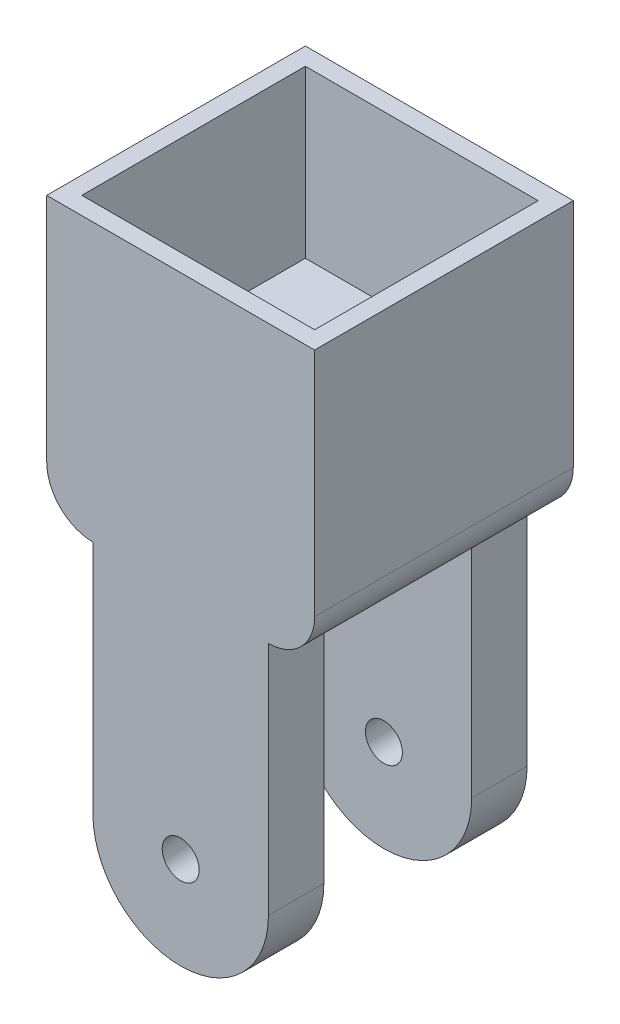
ISO-10303-21;
HEADER;
FILE_DESCRIPTION(('STEP AP214'),'2;1');
FILE_NAME('part.step','',(''),(''),'','','');
FILE_SCHEMA(('AUTOMOTIVE_DESIGN { 1 0 10303 214 1 1 1 1 }'));
ENDSEC;
DATA;
#1=APPLICATION_CONTEXT('core data for automotive mechanical design processes');
#2=APPLICATION_PROTOCOL_DEFINITION('international standard','automotive_design',2000,#1);
#3=PRODUCT_CONTEXT('',#1,'mechanical');
#4=PRODUCT('Part','Part','',(#3));
#5=PRODUCT_RELATED_PRODUCT_CATEGORY('part','',(#4));
#6=PRODUCT_DEFINITION_FORMATION('','',#4);
#7=PRODUCT_DEFINITION_CONTEXT('part definition',#1,'design');
#8=PRODUCT_DEFINITION('design','',#6,#7);
#9=PRODUCT_DEFINITION_SHAPE('','',#8);
#10=(LENGTH_UNIT() NAMED_UNIT(*) SI_UNIT(.MILLI.,.METRE.));
#11=(NAMED_UNIT(*) PLANE_ANGLE_UNIT() SI_UNIT($,.RADIAN.));
#12=(NAMED_UNIT(*) SI_UNIT($,.STERADIAN.) SOLID_ANGLE_UNIT());
#13=UNCERTAINTY_MEASURE_WITH_UNIT(LENGTH_MEASURE(1.E-05),#10,'distance_accuracy_value','');
#14=(GEOMETRIC_REPRESENTATION_CONTEXT(3) GLOBAL_UNCERTAINTY_ASSIGNED_CONTEXT((#13)) GLOBAL_UNIT_ASSIGNED_CONTEXT((#10,
#11,#12)) REPRESENTATION_CONTEXT('',''));
#15=CARTESIAN_POINT('',(0.,0.,0.));
#16=DIRECTION('',(0.,0.,1.));
#17=DIRECTION('',(1.,0.,0.));
#18=AXIS2_PLACEMENT_3D('',#15,#16,#17);
#19=CARTESIAN_POINT('',(0.,30.,0.));
#20=DIRECTION('',(0.,1.,0.));
#21=DIRECTION('',(0.,0.,1.));
#22=AXIS2_PLACEMENT_3D('',#19,#20,#21);
#23=PLANE('',#22);
#24=DIRECTION('',(1.,0.,0.));
#25=VECTOR('',#24,1.);
#26=CARTESIAN_POINT('',(-14.5,30.,-14.));
#27=LINE('',#26,#25);
#28=CARTESIAN_POINT('',(-14.5,30.,-14.));
#29=VERTEX_POINT('',#28);
#30=CARTESIAN_POINT('',(14.5,30.,-14.));
#31=VERTEX_POINT('',#30);
#32=EDGE_CURVE('E250',#29,#31,#27,.T.);
#33=ORIENTED_EDGE('',*,*,#32,.F.);
#34=DIRECTION('',(0.,0.,-1.));
#35=VECTOR('',#34,1.);
#36=CARTESIAN_POINT('',(-14.5,30.,14.));
#37=LINE('',#36,#35);
#38=CARTESIAN_POINT('',(-14.5,30.,14.));
#39=VERTEX_POINT('',#38);
#40=EDGE_CURVE('E257',#39,#29,#37,.T.);
#41=ORIENTED_EDGE('',*,*,#40,.F.);
#42=DIRECTION('',(1.,0.,0.));
#43=VECTOR('',#42,1.);
#44=CARTESIAN_POINT('',(-14.5,30.,14.));
#45=LINE('',#44,#43);
#46=CARTESIAN_POINT('',(14.5,30.,14.));
#47=VERTEX_POINT('',#46);
#48=EDGE_CURVE('E255',#39,#47,#45,.T.);
#49=ORIENTED_EDGE('',*,*,#48,.T.);
#50=DIRECTION('',(0.,0.,-1.));
#51=VECTOR('',#50,1.);
#52=CARTESIAN_POINT('',(14.5,30.,14.));
#53=LINE('',#52,#51);
#54=EDGE_CURVE('E253',#47,#31,#53,.T.);
#55=ORIENTED_EDGE('',*,*,#54,.T.);
#56=EDGE_LOOP('',(#33,#41,#49,#55));
#57=FACE_BOUND('',#56,.T.);
#58=DIRECTION('',(0.,0.,-1.));
#59=VECTOR('',#58,1.);
#60=CARTESIAN_POINT('',(12.6,30.,12.1));
#61=LINE('',#60,#59);
#62=CARTESIAN_POINT('',(12.6,30.,12.1));
#63=VERTEX_POINT('',#62);
#64=CARTESIAN_POINT('',(12.6,30.,-12.1));
#65=VERTEX_POINT('',#64);
#66=EDGE_CURVE('E188',#63,#65,#61,.T.);
#67=ORIENTED_EDGE('',*,*,#66,.F.);
#68=DIRECTION('',(-1.,0.,0.));
#69=VECTOR('',#68,1.);
#70=CARTESIAN_POINT('',(12.6,30.,12.1));
#71=LINE('',#70,#69);
#72=CARTESIAN_POINT('',(-12.6,30.,12.1));
#73=VERTEX_POINT('',#72);
#74=EDGE_CURVE('E168',#63,#73,#71,.T.);
#75=ORIENTED_EDGE('',*,*,#74,.T.);
#76=DIRECTION('',(0.,0.,-1.));
#77=VECTOR('',#76,1.);
#78=CARTESIAN_POINT('',(-12.6,30.,12.1));
#79=LINE('',#78,#77);
#80=CARTESIAN_POINT('',(-12.6,30.,-12.1));
#81=VERTEX_POINT('',#80);
#82=EDGE_CURVE('E178',#73,#81,#79,.T.);
#83=ORIENTED_EDGE('',*,*,#82,.T.);
#84=DIRECTION('',(-1.,0.,0.));
#85=VECTOR('',#84,1.);
#86=CARTESIAN_POINT('',(12.6,30.,-12.1));
#87=LINE('',#86,#85);
#88=EDGE_CURVE('E184',#65,#81,#87,.T.);
#89=ORIENTED_EDGE('',*,*,#88,.F.);
#90=EDGE_LOOP('',(#67,#75,#83,#89));
#91=FACE_BOUND('',#90,.T.);
#92=ADVANCED_FACE('F41',(#57,#91),#23,.T.);
#93=CARTESIAN_POINT('',(0.,0.,0.));
#94=DIRECTION('',(0.,1.,0.));
#95=DIRECTION('',(0.,0.,1.));
#96=AXIS2_PLACEMENT_3D('',#93,#94,#95);
#97=PLANE('',#96);
#98=DIRECTION('',(1.,0.,0.));
#99=VECTOR('',#98,1.);
#100=CARTESIAN_POINT('',(-9.5,0.,8.));
#101=LINE('',#100,#99);
#102=CARTESIAN_POINT('',(-9.5,0.,8.));
#103=VERTEX_POINT('',#102);
#104=CARTESIAN_POINT('',(9.5,0.,8.));
#105=VERTEX_POINT('',#104);
#106=EDGE_CURVE('E219',#103,#105,#101,.T.);
#107=ORIENTED_EDGE('',*,*,#106,.F.);
#108=DIRECTION('',(0.,0.,-1.));
#109=VECTOR('',#108,1.);
#110=CARTESIAN_POINT('',(-9.50000000000001,0.,-14.));
#111=LINE('',#110,#109);
#112=CARTESIAN_POINT('',(-9.5,0.,-8.));
#113=VERTEX_POINT('',#112);
#114=EDGE_CURVE('E277',#103,#113,#111,.T.);
#115=ORIENTED_EDGE('',*,*,#114,.T.);
#116=DIRECTION('',(-1.,0.,0.));
#117=VECTOR('',#116,1.);
#118=CARTESIAN_POINT('',(-9.5,0.,-8.));
#119=LINE('',#118,#117);
#120=CARTESIAN_POINT('',(9.5,0.,-8.));
#121=VERTEX_POINT('',#120);
#122=EDGE_CURVE('E239',#121,#113,#119,.T.);
#123=ORIENTED_EDGE('',*,*,#122,.F.);
#124=DIRECTION('',(0.,0.,-1.));
#125=VECTOR('',#124,1.);
#126=CARTESIAN_POINT('',(9.5,0.,0.));
#127=LINE('',#126,#125);
#128=EDGE_CURVE('E264',#121,#105,#127,.F.);
#129=ORIENTED_EDGE('',*,*,#128,.T.);
#130=EDGE_LOOP('',(#107,#115,#123,#129));
#131=FACE_BOUND('',#130,.T.);
#132=ADVANCED_FACE('F347',(#131),#97,.F.);
#133=CARTESIAN_POINT('',(-14.5,30.,-14.));
#134=DIRECTION('',(0.,0.,-1.));
#135=DIRECTION('',(-1.,0.,0.));
#136=AXIS2_PLACEMENT_3D('',#133,#134,#135);
#137=PLANE('',#136);
#138=CARTESIAN_POINT('',(0.,-25.,-14.));
#139=DIRECTION('',(0.,0.,-1.));
#140=DIRECTION('',(-1.,0.,0.));
#141=AXIS2_PLACEMENT_3D('',#138,#139,#140);
#142=CIRCLE('',#141,2.);
#143=CARTESIAN_POINT('',(-2.,-25.,-14.));
#144=VERTEX_POINT('',#143);
#145=EDGE_CURVE('E206',#144,#144,#142,.T.);
#146=ORIENTED_EDGE('',*,*,#145,.F.);
#147=EDGE_LOOP('',(#146));
#148=FACE_BOUND('',#147,.T.);
#149=DIRECTION('',(0.,1.,0.));
#150=VECTOR('',#149,1.);
#151=CARTESIAN_POINT('',(9.5,-35.,-14.));
#152=LINE('',#151,#150);
#153=CARTESIAN_POINT('',(9.5,-25.5,-14.));
#154=VERTEX_POINT('',#153);
#155=CARTESIAN_POINT('',(9.49999999999999,0.,-14.));
#156=VERTEX_POINT('',#155);
#157=EDGE_CURVE('E246',#154,#156,#152,.T.);
#158=ORIENTED_EDGE('',*,*,#157,.F.);
#159=CARTESIAN_POINT('',(0.,-25.5,-14.));
#160=DIRECTION('',(0.,0.,-1.));
#161=DIRECTION('',(-1.,0.,0.));
#162=AXIS2_PLACEMENT_3D('',#159,#160,#161);
#163=CIRCLE('',#162,9.5);
#164=CARTESIAN_POINT('',(0.,-35.,-14.));
#165=VERTEX_POINT('',#164);
#166=EDGE_CURVE('E304',#154,#165,#163,.T.);
#167=ORIENTED_EDGE('',*,*,#166,.T.);
#168=CARTESIAN_POINT('',(0.,-25.5,-14.));
#169=DIRECTION('',(0.,0.,-1.));
#170=DIRECTION('',(-1.,0.,0.));
#171=AXIS2_PLACEMENT_3D('',#168,#169,#170);
#172=CIRCLE('',#171,9.5);
#173=CARTESIAN_POINT('',(-9.50000000000001,-25.5,-14.));
#174=VERTEX_POINT('',#173);
#175=EDGE_CURVE('E302',#165,#174,#172,.T.);
#176=ORIENTED_EDGE('',*,*,#175,.T.);
#177=DIRECTION('',(0.,1.,0.));
#178=VECTOR('',#177,1.);
#179=CARTESIAN_POINT('',(-9.50000000000001,-35.,-14.));
#180=LINE('',#179,#178);
#181=CARTESIAN_POINT('',(-9.50000000000001,0.,-14.));
#182=VERTEX_POINT('',#181);
#183=EDGE_CURVE('E248',#174,#182,#180,.T.);
#184=ORIENTED_EDGE('',*,*,#183,.T.);
#185=CARTESIAN_POINT('',(-9.50000000000001,5.,-14.));
#186=DIRECTION('',(0.,0.,-1.));
#187=DIRECTION('',(-1.,0.,0.));
#188=AXIS2_PLACEMENT_3D('',#185,#186,#187);
#189=CIRCLE('',#188,5.);
#190=CARTESIAN_POINT('',(-14.5,5.,-14.));
#191=VERTEX_POINT('',#190);
#192=EDGE_CURVE('E283',#182,#191,#189,.T.);
#193=ORIENTED_EDGE('',*,*,#192,.T.);
#194=DIRECTION('',(0.,-1.,0.));
#195=VECTOR('',#194,1.);
#196=CARTESIAN_POINT('',(-14.5,30.,-14.));
#197=LINE('',#196,#195);
#198=EDGE_CURVE('E261',#29,#191,#197,.T.);
#199=ORIENTED_EDGE('',*,*,#198,.F.);
#200=ORIENTED_EDGE('',*,*,#32,.T.);
#201=DIRECTION('',(0.,-1.,0.));
#202=VECTOR('',#201,1.);
#203=CARTESIAN_POINT('',(14.5,30.,-14.));
#204=LINE('',#203,#202);
#205=CARTESIAN_POINT('',(14.5,5.,-14.));
#206=VERTEX_POINT('',#205);
#207=EDGE_CURVE('E260',#31,#206,#204,.T.);
#208=ORIENTED_EDGE('',*,*,#207,.T.);
#209=CARTESIAN_POINT('',(9.5,5.,-14.));
#210=DIRECTION('',(0.,0.,-1.));
#211=DIRECTION('',(-1.,0.,0.));
#212=AXIS2_PLACEMENT_3D('',#209,#210,#211);
#213=CIRCLE('',#212,5.);
#214=EDGE_CURVE('E280',#206,#156,#213,.T.);
#215=ORIENTED_EDGE('',*,*,#214,.T.);
#216=EDGE_LOOP('',(#158,#167,#176,#184,#193,#199,#200,#208,#215));
#217=FACE_BOUND('',#216,.T.);
#218=ADVANCED_FACE('F367',(#148,#217),#137,.T.);
#219=CARTESIAN_POINT('',(-14.5,30.,14.));
#220=DIRECTION('',(-1.,0.,0.));
#221=DIRECTION('',(0.,0.,1.));
#222=AXIS2_PLACEMENT_3D('',#219,#220,#221);
#223=PLANE('',#222);
#224=ORIENTED_EDGE('',*,*,#198,.T.);
#225=DIRECTION('',(0.,0.,-1.));
#226=VECTOR('',#225,1.);
#227=CARTESIAN_POINT('',(-14.5,5.,14.));
#228=LINE('',#227,#226);
#229=CARTESIAN_POINT('',(-14.5,5.,14.));
#230=VERTEX_POINT('',#229);
#231=EDGE_CURVE('E285',#191,#230,#228,.F.);
#232=ORIENTED_EDGE('',*,*,#231,.T.);
#233=DIRECTION('',(0.,-1.,0.));
#234=VECTOR('',#233,1.);
#235=CARTESIAN_POINT('',(-14.5,30.,14.));
#236=LINE('',#235,#234);
#237=EDGE_CURVE('E265',#39,#230,#236,.T.);
#238=ORIENTED_EDGE('',*,*,#237,.F.);
#239=ORIENTED_EDGE('',*,*,#40,.T.);
#240=EDGE_LOOP('',(#224,#232,#238,#239));
#241=FACE_BOUND('',#240,.T.);
#242=ADVANCED_FACE('F372',(#241),#223,.T.);
#243=CARTESIAN_POINT('',(-14.5,30.,14.));
#244=DIRECTION('',(0.,0.,-1.));
#245=DIRECTION('',(-1.,0.,0.));
#246=AXIS2_PLACEMENT_3D('',#243,#244,#245);
#247=PLANE('',#246);
#248=CARTESIAN_POINT('',(0.,-25.,14.));
#249=DIRECTION('',(0.,0.,-1.));
#250=DIRECTION('',(-1.,0.,0.));
#251=AXIS2_PLACEMENT_3D('',#248,#249,#250);
#252=CIRCLE('',#251,2.);
#253=CARTESIAN_POINT('',(-2.,-25.,14.));
#254=VERTEX_POINT('',#253);
#255=EDGE_CURVE('E207',#254,#254,#252,.T.);
#256=ORIENTED_EDGE('',*,*,#255,.T.);
#257=EDGE_LOOP('',(#256));
#258=FACE_BOUND('',#257,.T.);
#259=CARTESIAN_POINT('',(0.,-25.5,14.));
#260=DIRECTION('',(0.,0.,-1.));
#261=DIRECTION('',(-1.,0.,0.));
#262=AXIS2_PLACEMENT_3D('',#259,#260,#261);
#263=CIRCLE('',#262,9.5);
#264=CARTESIAN_POINT('',(-9.50000000000001,-25.5,14.));
#265=VERTEX_POINT('',#264);
#266=CARTESIAN_POINT('',(0.,-35.,14.));
#267=VERTEX_POINT('',#266);
#268=EDGE_CURVE('E308',#265,#267,#263,.F.);
#269=ORIENTED_EDGE('',*,*,#268,.T.);
#270=CARTESIAN_POINT('',(0.,-25.5,14.));
#271=DIRECTION('',(0.,0.,-1.));
#272=DIRECTION('',(-1.,0.,0.));
#273=AXIS2_PLACEMENT_3D('',#270,#271,#272);
#274=CIRCLE('',#273,9.5);
#275=CARTESIAN_POINT('',(9.5,-25.5,14.));
#276=VERTEX_POINT('',#275);
#277=EDGE_CURVE('E310',#267,#276,#274,.F.);
#278=ORIENTED_EDGE('',*,*,#277,.T.);
#279=DIRECTION('',(0.,1.,0.));
#280=VECTOR('',#279,1.);
#281=CARTESIAN_POINT('',(9.5,-35.,14.));
#282=LINE('',#281,#280);
#283=CARTESIAN_POINT('',(9.49999999999999,0.,14.));
#284=VERTEX_POINT('',#283);
#285=EDGE_CURVE('E227',#276,#284,#282,.T.);
#286=ORIENTED_EDGE('',*,*,#285,.T.);
#287=CARTESIAN_POINT('',(9.5,5.,14.));
#288=DIRECTION('',(0.,0.,-1.));
#289=DIRECTION('',(-1.,0.,0.));
#290=AXIS2_PLACEMENT_3D('',#287,#288,#289);
#291=CIRCLE('',#290,5.);
#292=CARTESIAN_POINT('',(14.5,5.,14.));
#293=VERTEX_POINT('',#292);
#294=EDGE_CURVE('E287',#284,#293,#291,.F.);
#295=ORIENTED_EDGE('',*,*,#294,.T.);
#296=DIRECTION('',(0.,-1.,0.));
#297=VECTOR('',#296,1.);
#298=CARTESIAN_POINT('',(14.5,30.,14.));
#299=LINE('',#298,#297);
#300=EDGE_CURVE('E268',#47,#293,#299,.T.);
#301=ORIENTED_EDGE('',*,*,#300,.F.);
#302=ORIENTED_EDGE('',*,*,#48,.F.);
#303=ORIENTED_EDGE('',*,*,#237,.T.);
#304=CARTESIAN_POINT('',(-9.50000000000001,5.,14.));
#305=DIRECTION('',(0.,0.,-1.));
#306=DIRECTION('',(-1.,0.,0.));
#307=AXIS2_PLACEMENT_3D('',#304,#305,#306);
#308=CIRCLE('',#307,5.);
#309=CARTESIAN_POINT('',(-9.50000000000001,0.,14.));
#310=VERTEX_POINT('',#309);
#311=EDGE_CURVE('E289',#230,#310,#308,.F.);
#312=ORIENTED_EDGE('',*,*,#311,.T.);
#313=DIRECTION('',(0.,1.,0.));
#314=VECTOR('',#313,1.);
#315=CARTESIAN_POINT('',(-9.50000000000001,-35.,14.));
#316=LINE('',#315,#314);
#317=EDGE_CURVE('E225',#265,#310,#316,.T.);
#318=ORIENTED_EDGE('',*,*,#317,.F.);
#319=EDGE_LOOP('',(#269,#278,#286,#295,#301,#302,#303,#312,#318));
#320=FACE_BOUND('',#319,.T.);
#321=ADVANCED_FACE('F336',(#258,#320),#247,.F.);
#322=CARTESIAN_POINT('',(14.5,30.,14.));
#323=DIRECTION('',(-1.,0.,0.));
#324=DIRECTION('',(0.,0.,1.));
#325=AXIS2_PLACEMENT_3D('',#322,#323,#324);
#326=PLANE('',#325);
#327=ORIENTED_EDGE('',*,*,#300,.T.);
#328=DIRECTION('',(0.,0.,-1.));
#329=VECTOR('',#328,1.);
#330=CARTESIAN_POINT('',(14.5,5.,14.));
#331=LINE('',#330,#329);
#332=EDGE_CURVE('E292',#293,#206,#331,.T.);
#333=ORIENTED_EDGE('',*,*,#332,.T.);
#334=ORIENTED_EDGE('',*,*,#207,.F.);
#335=ORIENTED_EDGE('',*,*,#54,.F.);
#336=EDGE_LOOP('',(#327,#333,#334,#335));
#337=FACE_BOUND('',#336,.T.);
#338=ADVANCED_FACE('F363',(#337),#326,.F.);
#339=CARTESIAN_POINT('',(-9.50000000000001,-35.,-14.));
#340=DIRECTION('',(1.,0.,0.));
#341=DIRECTION('',(0.,0.,-1.));
#342=AXIS2_PLACEMENT_3D('',#339,#340,#341);
#343=PLANE('',#342);
#344=ORIENTED_EDGE('',*,*,#183,.F.);
#345=DIRECTION('',(0.,0.,-1.));
#346=VECTOR('',#345,1.);
#347=CARTESIAN_POINT('',(-9.50000000000001,-25.5,-14.));
#348=LINE('',#347,#346);
#349=CARTESIAN_POINT('',(-9.5,-25.5,-8.));
#350=VERTEX_POINT('',#349);
#351=EDGE_CURVE('E306',#174,#350,#348,.F.);
#352=ORIENTED_EDGE('',*,*,#351,.T.);
#353=DIRECTION('',(0.,1.,0.));
#354=VECTOR('',#353,1.);
#355=CARTESIAN_POINT('',(-9.5,-35.,-8.));
#356=LINE('',#355,#354);
#357=EDGE_CURVE('E242',#350,#113,#356,.T.);
#358=ORIENTED_EDGE('',*,*,#357,.T.);
#359=DIRECTION('',(0.,0.,-1.));
#360=VECTOR('',#359,1.);
#361=CARTESIAN_POINT('',(-9.50000000000001,0.,-14.));
#362=LINE('',#361,#360);
#363=EDGE_CURVE('E233',#113,#182,#362,.T.);
#364=ORIENTED_EDGE('',*,*,#363,.T.);
#365=EDGE_LOOP('',(#344,#352,#358,#364));
#366=FACE_BOUND('',#365,.T.);
#367=ADVANCED_FACE('F378',(#366),#343,.F.);
#368=CARTESIAN_POINT('',(9.5,-35.,-14.));
#369=DIRECTION('',(-1.,0.,0.));
#370=DIRECTION('',(0.,0.,1.));
#371=AXIS2_PLACEMENT_3D('',#368,#369,#370);
#372=PLANE('',#371);
#373=DIRECTION('',(0.,1.,0.));
#374=VECTOR('',#373,1.);
#375=CARTESIAN_POINT('',(9.5,-35.,-8.));
#376=LINE('',#375,#374);
#377=CARTESIAN_POINT('',(9.5,-25.5,-8.));
#378=VERTEX_POINT('',#377);
#379=EDGE_CURVE('E244',#378,#121,#376,.T.);
#380=ORIENTED_EDGE('',*,*,#379,.F.);
#381=DIRECTION('',(0.,0.,1.));
#382=VECTOR('',#381,1.);
#383=CARTESIAN_POINT('',(9.5,-25.5,-14.));
#384=LINE('',#383,#382);
#385=EDGE_CURVE('E299',#378,#154,#384,.F.);
#386=ORIENTED_EDGE('',*,*,#385,.T.);
#387=ORIENTED_EDGE('',*,*,#157,.T.);
#388=DIRECTION('',(0.,0.,1.));
#389=VECTOR('',#388,1.);
#390=CARTESIAN_POINT('',(9.5,0.,-14.));
#391=LINE('',#390,#389);
#392=EDGE_CURVE('E236',#156,#121,#391,.T.);
#393=ORIENTED_EDGE('',*,*,#392,.T.);
#394=EDGE_LOOP('',(#380,#386,#387,#393));
#395=FACE_BOUND('',#394,.T.);
#396=ADVANCED_FACE('F389',(#395),#372,.F.);
#397=CARTESIAN_POINT('',(-9.5,-35.,-8.));
#398=DIRECTION('',(0.,0.,-1.));
#399=DIRECTION('',(-1.,0.,0.));
#400=AXIS2_PLACEMENT_3D('',#397,#398,#399);
#401=PLANE('',#400);
#402=CARTESIAN_POINT('',(0.,-25.,-8.00000000000001));
#403=DIRECTION('',(0.,0.,-1.));
#404=DIRECTION('',(-1.,0.,0.));
#405=AXIS2_PLACEMENT_3D('',#402,#403,#404);
#406=CIRCLE('',#405,2.);
#407=CARTESIAN_POINT('',(-2.,-25.,-8.00000000000001));
#408=VERTEX_POINT('',#407);
#409=EDGE_CURVE('E213',#408,#408,#406,.T.);
#410=ORIENTED_EDGE('',*,*,#409,.T.);
#411=EDGE_LOOP('',(#410));
#412=FACE_BOUND('',#411,.T.);
#413=CARTESIAN_POINT('',(0.,-25.5,-8.));
#414=DIRECTION('',(0.,0.,-1.));
#415=DIRECTION('',(-1.,0.,0.));
#416=AXIS2_PLACEMENT_3D('',#413,#414,#415);
#417=CIRCLE('',#416,9.5);
#418=CARTESIAN_POINT('',(0.,-35.,-8.));
#419=VERTEX_POINT('',#418);
#420=EDGE_CURVE('E295',#350,#419,#417,.F.);
#421=ORIENTED_EDGE('',*,*,#420,.T.);
#422=CARTESIAN_POINT('',(0.,-25.5,-8.));
#423=DIRECTION('',(0.,0.,-1.));
#424=DIRECTION('',(-1.,0.,0.));
#425=AXIS2_PLACEMENT_3D('',#422,#423,#424);
#426=CIRCLE('',#425,9.5);
#427=EDGE_CURVE('E297',#419,#378,#426,.F.);
#428=ORIENTED_EDGE('',*,*,#427,.T.);
#429=ORIENTED_EDGE('',*,*,#379,.T.);
#430=ORIENTED_EDGE('',*,*,#122,.T.);
#431=ORIENTED_EDGE('',*,*,#357,.F.);
#432=EDGE_LOOP('',(#421,#428,#429,#430,#431));
#433=FACE_BOUND('',#432,.T.);
#434=ADVANCED_FACE('F382',(#412,#433),#401,.F.);
#435=CARTESIAN_POINT('',(-9.50000000000001,-35.,14.));
#436=DIRECTION('',(1.,0.,0.));
#437=DIRECTION('',(0.,0.,-1.));
#438=AXIS2_PLACEMENT_3D('',#435,#436,#437);
#439=PLANE('',#438);
#440=DIRECTION('',(0.,1.,0.));
#441=VECTOR('',#440,1.);
#442=CARTESIAN_POINT('',(-9.5,-35.,8.));
#443=LINE('',#442,#441);
#444=CARTESIAN_POINT('',(-9.5,-25.5,8.));
#445=VERTEX_POINT('',#444);
#446=EDGE_CURVE('E231',#445,#103,#443,.T.);
#447=ORIENTED_EDGE('',*,*,#446,.F.);
#448=DIRECTION('',(0.,0.,-1.));
#449=VECTOR('',#448,1.);
#450=CARTESIAN_POINT('',(-9.50000000000001,-25.5,14.));
#451=LINE('',#450,#449);
#452=EDGE_CURVE('E12',#445,#265,#451,.F.);
#453=ORIENTED_EDGE('',*,*,#452,.T.);
#454=ORIENTED_EDGE('',*,*,#317,.T.);
#455=DIRECTION('',(0.,0.,-1.));
#456=VECTOR('',#455,1.);
#457=CARTESIAN_POINT('',(-9.50000000000001,0.,14.));
#458=LINE('',#457,#456);
#459=EDGE_CURVE('E216',#310,#103,#458,.T.);
#460=ORIENTED_EDGE('',*,*,#459,.T.);
#461=EDGE_LOOP('',(#447,#453,#454,#460));
#462=FACE_BOUND('',#461,.T.);
#463=ADVANCED_FACE('F334',(#462),#439,.F.);
#464=CARTESIAN_POINT('',(-9.5,-35.,8.));
#465=DIRECTION('',(0.,0.,1.));
#466=DIRECTION('',(1.,0.,0.));
#467=AXIS2_PLACEMENT_3D('',#464,#465,#466);
#468=PLANE('',#467);
#469=CARTESIAN_POINT('',(0.,-25.,8.));
#470=DIRECTION('',(0.,0.,1.));
#471=DIRECTION('',(1.,0.,0.));
#472=AXIS2_PLACEMENT_3D('',#469,#470,#471);
#473=CIRCLE('',#472,2.);
#474=CARTESIAN_POINT('',(2.,-25.,8.));
#475=VERTEX_POINT('',#474);
#476=EDGE_CURVE('E210',#475,#475,#473,.T.);
#477=ORIENTED_EDGE('',*,*,#476,.T.);
#478=EDGE_LOOP('',(#477));
#479=FACE_BOUND('',#478,.T.);
#480=DIRECTION('',(0.,1.,0.));
#481=VECTOR('',#480,1.);
#482=CARTESIAN_POINT('',(9.5,-35.,8.));
#483=LINE('',#482,#481);
#484=CARTESIAN_POINT('',(9.5,-25.5,8.));
#485=VERTEX_POINT('',#484);
#486=EDGE_CURVE('E229',#485,#105,#483,.T.);
#487=ORIENTED_EDGE('',*,*,#486,.F.);
#488=CARTESIAN_POINT('',(0.,-25.5,8.));
#489=DIRECTION('',(0.,0.,1.));
#490=DIRECTION('',(1.,0.,0.));
#491=AXIS2_PLACEMENT_3D('',#488,#489,#490);
#492=CIRCLE('',#491,9.5);
#493=CARTESIAN_POINT('',(0.,-35.,8.));
#494=VERTEX_POINT('',#493);
#495=EDGE_CURVE('E50',#485,#494,#492,.F.);
#496=ORIENTED_EDGE('',*,*,#495,.T.);
#497=CARTESIAN_POINT('',(0.,-25.5,8.));
#498=DIRECTION('',(0.,0.,1.));
#499=DIRECTION('',(1.,0.,0.));
#500=AXIS2_PLACEMENT_3D('',#497,#498,#499);
#501=CIRCLE('',#500,9.5);
#502=EDGE_CURVE('E58',#494,#445,#501,.F.);
#503=ORIENTED_EDGE('',*,*,#502,.T.);
#504=ORIENTED_EDGE('',*,*,#446,.T.);
#505=ORIENTED_EDGE('',*,*,#106,.T.);
#506=EDGE_LOOP('',(#487,#496,#503,#504,#505));
#507=FACE_BOUND('',#506,.T.);
#508=ADVANCED_FACE('F351',(#479,#507),#468,.F.);
#509=CARTESIAN_POINT('',(9.5,-35.,14.));
#510=DIRECTION('',(-1.,0.,0.));
#511=DIRECTION('',(0.,0.,1.));
#512=AXIS2_PLACEMENT_3D('',#509,#510,#511);
#513=PLANE('',#512);
#514=ORIENTED_EDGE('',*,*,#285,.F.);
#515=DIRECTION('',(0.,0.,1.));
#516=VECTOR('',#515,1.);
#517=CARTESIAN_POINT('',(9.5,-25.5,8.));
#518=LINE('',#517,#516);
#519=EDGE_CURVE('E312',#276,#485,#518,.F.);
#520=ORIENTED_EDGE('',*,*,#519,.T.);
#521=ORIENTED_EDGE('',*,*,#486,.T.);
#522=DIRECTION('',(0.,0.,1.));
#523=VECTOR('',#522,1.);
#524=CARTESIAN_POINT('',(9.5,0.,14.));
#525=LINE('',#524,#523);
#526=EDGE_CURVE('E222',#105,#284,#525,.T.);
#527=ORIENTED_EDGE('',*,*,#526,.T.);
#528=EDGE_LOOP('',(#514,#520,#521,#527));
#529=FACE_BOUND('',#528,.T.);
#530=ADVANCED_FACE('F359',(#529),#513,.F.);
#531=CARTESIAN_POINT('',(0.,-25.,14.));
#532=DIRECTION('',(0.,0.,-1.));
#533=DIRECTION('',(-1.,0.,0.));
#534=AXIS2_PLACEMENT_3D('',#531,#532,#533);
#535=CYLINDRICAL_SURFACE('',#534,2.);
#536=ORIENTED_EDGE('',*,*,#255,.F.);
#537=EDGE_LOOP('',(#536));
#538=FACE_BOUND('',#537,.T.);
#539=ORIENTED_EDGE('',*,*,#476,.F.);
#540=EDGE_LOOP('',(#539));
#541=FACE_BOUND('',#540,.T.);
#542=ADVANCED_FACE('F506',(#538,#541),#535,.F.);
#543=ORIENTED_EDGE('',*,*,#145,.T.);
#544=EDGE_LOOP('',(#543));
#545=FACE_BOUND('',#544,.T.);
#546=ORIENTED_EDGE('',*,*,#409,.F.);
#547=EDGE_LOOP('',(#546));
#548=FACE_BOUND('',#547,.T.);
#549=ADVANCED_FACE('F499',(#545,#548),#535,.F.);
#550=CARTESIAN_POINT('',(12.6,-34.9382312088062,12.1));
#551=DIRECTION('',(0.,0.,-1.));
#552=DIRECTION('',(-1.,0.,0.));
#553=AXIS2_PLACEMENT_3D('',#550,#551,#552);
#554=PLANE('',#553);
#555=DIRECTION('',(0.,1.,0.));
#556=VECTOR('',#555,1.);
#557=CARTESIAN_POINT('',(-12.6,-34.9382312088062,12.1));
#558=LINE('',#557,#556);
#559=CARTESIAN_POINT('',(-12.6,12.,12.1));
#560=VERTEX_POINT('',#559);
#561=EDGE_CURVE('E163',#560,#73,#558,.T.);
#562=ORIENTED_EDGE('',*,*,#561,.T.);
#563=ORIENTED_EDGE('',*,*,#74,.F.);
#564=DIRECTION('',(0.,1.,0.));
#565=VECTOR('',#564,1.);
#566=CARTESIAN_POINT('',(12.6,-34.9382312088062,12.1));
#567=LINE('',#566,#565);
#568=CARTESIAN_POINT('',(12.6,12.,12.1));
#569=VERTEX_POINT('',#568);
#570=EDGE_CURVE('E199',#569,#63,#567,.T.);
#571=ORIENTED_EDGE('',*,*,#570,.F.);
#572=DIRECTION('',(1.,0.,0.));
#573=VECTOR('',#572,1.);
#574=CARTESIAN_POINT('',(12.6,12.,12.1));
#575=LINE('',#574,#573);
#576=EDGE_CURVE('E171',#560,#569,#575,.T.);
#577=ORIENTED_EDGE('',*,*,#576,.F.);
#578=EDGE_LOOP('',(#562,#563,#571,#577));
#579=FACE_BOUND('',#578,.T.);
#580=ADVANCED_FACE('F165',(#579),#554,.T.);
#581=CARTESIAN_POINT('',(-12.6,-34.9382312088062,12.1));
#582=DIRECTION('',(1.,0.,0.));
#583=DIRECTION('',(0.,0.,-1.));
#584=AXIS2_PLACEMENT_3D('',#581,#582,#583);
#585=PLANE('',#584);
#586=DIRECTION('',(0.,1.,0.));
#587=VECTOR('',#586,1.);
#588=CARTESIAN_POINT('',(-12.6,-34.9382312088062,-12.1));
#589=LINE('',#588,#587);
#590=CARTESIAN_POINT('',(-12.6,12.,-12.1));
#591=VERTEX_POINT('',#590);
#592=EDGE_CURVE('E175',#591,#81,#589,.T.);
#593=ORIENTED_EDGE('',*,*,#592,.T.);
#594=ORIENTED_EDGE('',*,*,#82,.F.);
#595=ORIENTED_EDGE('',*,*,#561,.F.);
#596=DIRECTION('',(0.,0.,1.));
#597=VECTOR('',#596,1.);
#598=CARTESIAN_POINT('',(-12.6,12.,12.1));
#599=LINE('',#598,#597);
#600=EDGE_CURVE('E637',#591,#560,#599,.T.);
#601=ORIENTED_EDGE('',*,*,#600,.F.);
#602=EDGE_LOOP('',(#593,#594,#595,#601));
#603=FACE_BOUND('',#602,.T.);
#604=ADVANCED_FACE('F179',(#603),#585,.T.);
#605=CARTESIAN_POINT('',(12.6,-34.9382312088062,-12.1));
#606=DIRECTION('',(0.,0.,-1.));
#607=DIRECTION('',(-1.,0.,0.));
#608=AXIS2_PLACEMENT_3D('',#605,#606,#607);
#609=PLANE('',#608);
#610=DIRECTION('',(1.,0.,0.));
#611=VECTOR('',#610,1.);
#612=CARTESIAN_POINT('',(12.6,12.,-12.1));
#613=LINE('',#612,#611);
#614=CARTESIAN_POINT('',(12.6,12.,-12.1));
#615=VERTEX_POINT('',#614);
#616=EDGE_CURVE('E174',#591,#615,#613,.T.);
#617=ORIENTED_EDGE('',*,*,#616,.T.);
#618=DIRECTION('',(0.,1.,0.));
#619=VECTOR('',#618,1.);
#620=CARTESIAN_POINT('',(12.6,-34.9382312088062,-12.1));
#621=LINE('',#620,#619);
#622=EDGE_CURVE('E201',#615,#65,#621,.T.);
#623=ORIENTED_EDGE('',*,*,#622,.T.);
#624=ORIENTED_EDGE('',*,*,#88,.T.);
#625=ORIENTED_EDGE('',*,*,#592,.F.);
#626=EDGE_LOOP('',(#617,#623,#624,#625));
#627=FACE_BOUND('',#626,.T.);
#628=ADVANCED_FACE('F478',(#627),#609,.F.);
#629=CARTESIAN_POINT('',(12.6,-34.9382312088062,12.1));
#630=DIRECTION('',(1.,0.,0.));
#631=DIRECTION('',(0.,0.,-1.));
#632=AXIS2_PLACEMENT_3D('',#629,#630,#631);
#633=PLANE('',#632);
#634=DIRECTION('',(0.,0.,1.));
#635=VECTOR('',#634,1.);
#636=CARTESIAN_POINT('',(12.6,12.,12.1));
#637=LINE('',#636,#635);
#638=EDGE_CURVE('E204',#615,#569,#637,.T.);
#639=ORIENTED_EDGE('',*,*,#638,.T.);
#640=ORIENTED_EDGE('',*,*,#570,.T.);
#641=ORIENTED_EDGE('',*,*,#66,.T.);
#642=ORIENTED_EDGE('',*,*,#622,.F.);
#643=EDGE_LOOP('',(#639,#640,#641,#642));
#644=FACE_BOUND('',#643,.T.);
#645=ADVANCED_FACE('F470',(#644),#633,.F.);
#646=CARTESIAN_POINT('',(0.,12.,0.));
#647=DIRECTION('',(0.,1.,0.));
#648=DIRECTION('',(0.,0.,1.));
#649=AXIS2_PLACEMENT_3D('',#646,#647,#648);
#650=PLANE('',#649);
#651=CARTESIAN_POINT('',(0.,12.,0.));
#652=DIRECTION('',(0.,1.,0.));
#653=DIRECTION('',(0.,0.,1.));
#654=AXIS2_PLACEMENT_3D('',#651,#652,#653);
#655=CIRCLE('',#654,5.1);
#656=CARTESIAN_POINT('',(0.,12.,5.1));
#657=VERTEX_POINT('',#656);
#658=EDGE_CURVE('E192',#657,#657,#655,.T.);
#659=ORIENTED_EDGE('',*,*,#658,.F.);
#660=EDGE_LOOP('',(#659));
#661=FACE_BOUND('',#660,.T.);
#662=ORIENTED_EDGE('',*,*,#600,.T.);
#663=ORIENTED_EDGE('',*,*,#576,.T.);
#664=ORIENTED_EDGE('',*,*,#638,.F.);
#665=ORIENTED_EDGE('',*,*,#616,.F.);
#666=EDGE_LOOP('',(#662,#663,#664,#665));
#667=FACE_BOUND('',#666,.T.);
#668=ADVANCED_FACE('F462',(#661,#667),#650,.T.);
#669=CARTESIAN_POINT('',(0.,2.,0.));
#670=DIRECTION('',(0.,1.,0.));
#671=DIRECTION('',(0.,0.,1.));
#672=AXIS2_PLACEMENT_3D('',#669,#670,#671);
#673=CYLINDRICAL_SURFACE('',#672,5.1);
#674=CARTESIAN_POINT('',(0.,2.,0.));
#675=DIRECTION('',(0.,1.,0.));
#676=DIRECTION('',(0.,0.,1.));
#677=AXIS2_PLACEMENT_3D('',#674,#675,#676);
#678=CIRCLE('',#677,5.1);
#679=CARTESIAN_POINT('',(0.,2.,5.1));
#680=VERTEX_POINT('',#679);
#681=EDGE_CURVE('E189',#680,#680,#678,.T.);
#682=ORIENTED_EDGE('',*,*,#681,.F.);
#683=EDGE_LOOP('',(#682));
#684=FACE_BOUND('',#683,.T.);
#685=ORIENTED_EDGE('',*,*,#658,.T.);
#686=EDGE_LOOP('',(#685));
#687=FACE_BOUND('',#686,.T.);
#688=ADVANCED_FACE('F454',(#684,#687),#673,.F.);
#689=CARTESIAN_POINT('',(0.,2.,0.));
#690=DIRECTION('',(0.,1.,0.));
#691=DIRECTION('',(0.,0.,1.));
#692=AXIS2_PLACEMENT_3D('',#689,#690,#691);
#693=PLANE('',#692);
#694=ORIENTED_EDGE('',*,*,#681,.T.);
#695=EDGE_LOOP('',(#694));
#696=FACE_BOUND('',#695,.T.);
#697=ADVANCED_FACE('F419',(#696),#693,.T.);
#698=CARTESIAN_POINT('',(-9.50000000000001,5.,0.));
#699=DIRECTION('',(0.,0.,1.));
#700=DIRECTION('',(1.,0.,0.));
#701=AXIS2_PLACEMENT_3D('',#698,#699,#700);
#702=CYLINDRICAL_SURFACE('',#701,5.);
#703=ORIENTED_EDGE('',*,*,#311,.F.);
#704=ORIENTED_EDGE('',*,*,#231,.F.);
#705=ORIENTED_EDGE('',*,*,#192,.F.);
#706=ORIENTED_EDGE('',*,*,#363,.F.);
#707=ORIENTED_EDGE('',*,*,#114,.F.);
#708=ORIENTED_EDGE('',*,*,#459,.F.);
#709=EDGE_LOOP('',(#703,#704,#705,#706,#707,#708));
#710=FACE_BOUND('',#709,.T.);
#711=ADVANCED_FACE('F343',(#710),#702,.T.);
#712=CARTESIAN_POINT('',(9.5,5.,14.));
#713=DIRECTION('',(0.,0.,-1.));
#714=DIRECTION('',(-1.,0.,0.));
#715=AXIS2_PLACEMENT_3D('',#712,#713,#714);
#716=CYLINDRICAL_SURFACE('',#715,5.);
#717=ORIENTED_EDGE('',*,*,#128,.F.);
#718=ORIENTED_EDGE('',*,*,#392,.F.);
#719=ORIENTED_EDGE('',*,*,#214,.F.);
#720=ORIENTED_EDGE('',*,*,#332,.F.);
#721=ORIENTED_EDGE('',*,*,#294,.F.);
#722=ORIENTED_EDGE('',*,*,#526,.F.);
#723=EDGE_LOOP('',(#717,#718,#719,#720,#721,#722));
#724=FACE_BOUND('',#723,.T.);
#725=ADVANCED_FACE('F354',(#724),#716,.T.);
#726=CARTESIAN_POINT('',(0.,-25.5,0.));
#727=DIRECTION('',(0.,0.,-1.));
#728=DIRECTION('',(-1.,0.,0.));
#729=AXIS2_PLACEMENT_3D('',#726,#727,#728);
#730=CYLINDRICAL_SURFACE('',#729,9.5);
#731=ORIENTED_EDGE('',*,*,#351,.F.);
#732=ORIENTED_EDGE('',*,*,#175,.F.);
#733=DIRECTION('',(0.,0.,-1.));
#734=VECTOR('',#733,1.);
#735=CARTESIAN_POINT('',(0.,-35.,0.));
#736=LINE('',#735,#734);
#737=EDGE_CURVE('E316',#419,#165,#736,.T.);
#738=ORIENTED_EDGE('',*,*,#737,.F.);
#739=ORIENTED_EDGE('',*,*,#420,.F.);
#740=EDGE_LOOP('',(#731,#732,#738,#739));
#741=FACE_BOUND('',#740,.T.);
#742=ADVANCED_FACE('F384',(#741),#730,.T.);
#743=CARTESIAN_POINT('',(0.,-25.5,0.));
#744=DIRECTION('',(0.,0.,1.));
#745=DIRECTION('',(1.,0.,0.));
#746=AXIS2_PLACEMENT_3D('',#743,#744,#745);
#747=CYLINDRICAL_SURFACE('',#746,9.5);
#748=ORIENTED_EDGE('',*,*,#166,.F.);
#749=ORIENTED_EDGE('',*,*,#385,.F.);
#750=ORIENTED_EDGE('',*,*,#427,.F.);
#751=ORIENTED_EDGE('',*,*,#737,.T.);
#752=EDGE_LOOP('',(#748,#749,#750,#751));
#753=FACE_BOUND('',#752,.T.);
#754=ADVANCED_FACE('F386',(#753),#747,.T.);
#755=CARTESIAN_POINT('',(0.,-25.5,0.));
#756=DIRECTION('',(0.,0.,1.));
#757=DIRECTION('',(1.,0.,0.));
#758=AXIS2_PLACEMENT_3D('',#755,#756,#757);
#759=CYLINDRICAL_SURFACE('',#758,9.5);
#760=ORIENTED_EDGE('',*,*,#452,.F.);
#761=ORIENTED_EDGE('',*,*,#502,.F.);
#762=DIRECTION('',(0.,0.,-1.));
#763=VECTOR('',#762,1.);
#764=CARTESIAN_POINT('',(0.,-35.,8.));
#765=LINE('',#764,#763);
#766=EDGE_CURVE('E45',#267,#494,#765,.T.);
#767=ORIENTED_EDGE('',*,*,#766,.F.);
#768=ORIENTED_EDGE('',*,*,#268,.F.);
#769=EDGE_LOOP('',(#760,#761,#767,#768));
#770=FACE_BOUND('',#769,.T.);
#771=ADVANCED_FACE('F43',(#770),#759,.T.);
#772=CARTESIAN_POINT('',(0.,-25.5,0.));
#773=DIRECTION('',(0.,0.,-1.));
#774=DIRECTION('',(-1.,0.,0.));
#775=AXIS2_PLACEMENT_3D('',#772,#773,#774);
#776=CYLINDRICAL_SURFACE('',#775,9.5);
#777=ORIENTED_EDGE('',*,*,#495,.F.);
#778=ORIENTED_EDGE('',*,*,#519,.F.);
#779=ORIENTED_EDGE('',*,*,#277,.F.);
#780=ORIENTED_EDGE('',*,*,#766,.T.);
#781=EDGE_LOOP('',(#777,#778,#779,#780));
#782=FACE_BOUND('',#781,.T.);
#783=ADVANCED_FACE('F327',(#782),#776,.T.);
#784=CLOSED_SHELL('',(#92,#132,#218,#242,#321,#338,#367,#396,#434,#463,#508,#530,#542,#549,#580,
#604,#628,#645,#668,#688,#697,#711,#725,#742,#754,#771,#783));
#785=MANIFOLD_SOLID_BREP('B2',#784);
#786=ADVANCED_BREP_SHAPE_REPRESENTATION('',(#18,#785),#14);
#787=SHAPE_DEFINITION_REPRESENTATION(#9,#786);
ENDSEC;
END-ISO-10303-21;
